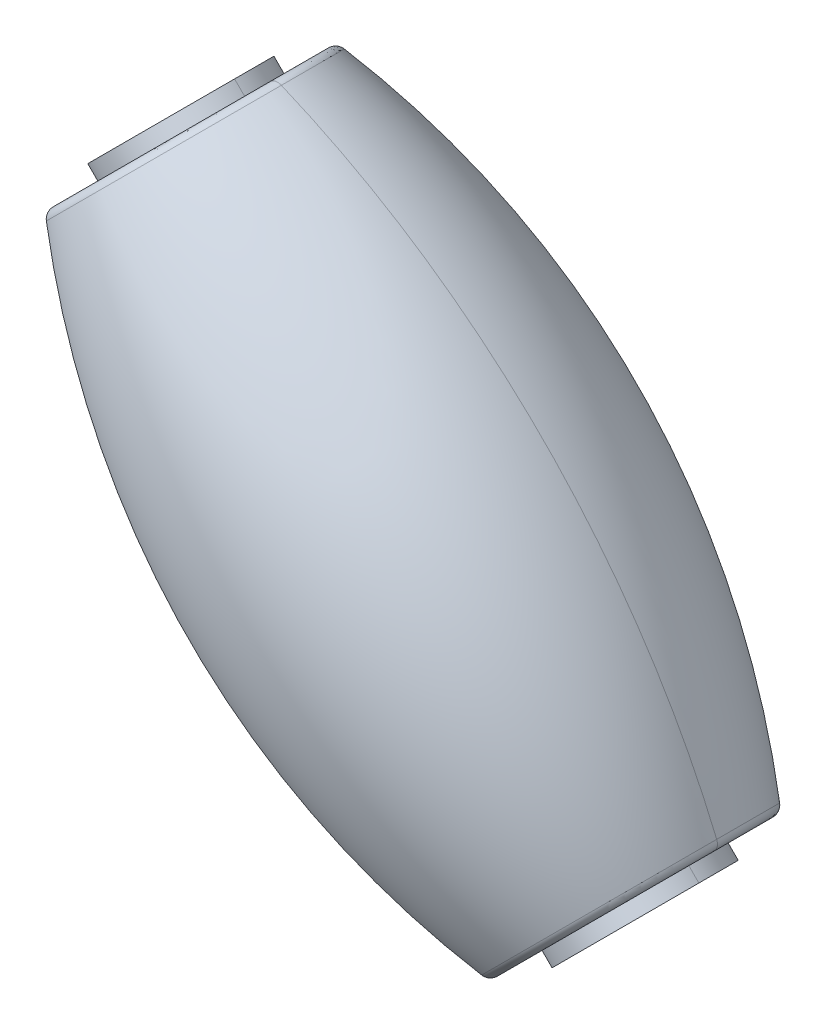
ISO-10303-21;
HEADER;
FILE_DESCRIPTION(('STEP AP214'),'2;1');
FILE_NAME('part.step','',(''),(''),'','','');
FILE_SCHEMA(('AUTOMOTIVE_DESIGN { 1 0 10303 214 1 1 1 1 }'));
ENDSEC;
DATA;
#1=APPLICATION_CONTEXT('core data for automotive mechanical design processes');
#2=APPLICATION_PROTOCOL_DEFINITION('international standard','automotive_design',2000,#1);
#3=PRODUCT_CONTEXT('',#1,'mechanical');
#4=PRODUCT('Part','Part','',(#3));
#5=PRODUCT_RELATED_PRODUCT_CATEGORY('part','',(#4));
#6=PRODUCT_DEFINITION_FORMATION('','',#4);
#7=PRODUCT_DEFINITION_CONTEXT('part definition',#1,'design');
#8=PRODUCT_DEFINITION('design','',#6,#7);
#9=PRODUCT_DEFINITION_SHAPE('','',#8);
#10=(LENGTH_UNIT() NAMED_UNIT(*) SI_UNIT(.MILLI.,.METRE.));
#11=(NAMED_UNIT(*) PLANE_ANGLE_UNIT() SI_UNIT($,.RADIAN.));
#12=(NAMED_UNIT(*) SI_UNIT($,.STERADIAN.) SOLID_ANGLE_UNIT());
#13=UNCERTAINTY_MEASURE_WITH_UNIT(LENGTH_MEASURE(1.E-05),#10,'distance_accuracy_value','');
#14=(GEOMETRIC_REPRESENTATION_CONTEXT(3) GLOBAL_UNCERTAINTY_ASSIGNED_CONTEXT((#13)) GLOBAL_UNIT_ASSIGNED_CONTEXT((#10,
#11,#12)) REPRESENTATION_CONTEXT('',''));
#15=CARTESIAN_POINT('',(0.,0.,0.));
#16=DIRECTION('',(0.,0.,1.));
#17=DIRECTION('',(1.,0.,0.));
#18=AXIS2_PLACEMENT_3D('',#15,#16,#17);
#19=CARTESIAN_POINT('',(52.5404268199212,3.13716113070749,0.));
#20=DIRECTION('',(-0.707106781186548,0.707106781186548,0.));
#21=DIRECTION('',(-0.707106781186548,-0.707106781186548,0.));
#22=AXIS2_PLACEMENT_3D('',#19,#20,#21);
#23=CYLINDRICAL_SURFACE('',#22,4.7625);
#24=CARTESIAN_POINT('',(13.9193969876572,41.7581909629715,0.));
#25=DIRECTION('',(0.707106781186548,-0.707106781186548,0.));
#26=DIRECTION('',(0.707106781186548,0.707106781186548,0.));
#27=AXIS2_PLACEMENT_3D('',#24,#25,#26);
#28=CIRCLE('',#27,4.7625);
#29=CARTESIAN_POINT('',(17.2869930330581,45.1257870083725,0.));
#30=VERTEX_POINT('',#29);
#31=CARTESIAN_POINT('',(10.5518009422562,38.3905949175706,0.));
#32=VERTEX_POINT('',#31);
#33=EDGE_CURVE('E20',#30,#32,#28,.T.);
#34=ORIENTED_EDGE('',*,*,#33,.F.);
#35=DIRECTION('',(-0.707106781186548,0.707106781186548,0.));
#36=VECTOR('',#35,1.);
#37=CARTESIAN_POINT('',(55.9080228653222,6.50475717610842,0.));
#38=LINE('',#37,#36);
#39=CARTESIAN_POINT('',(16.6583751045832,45.7544049368473,0.));
#40=VERTEX_POINT('',#39);
#41=EDGE_CURVE('E11',#30,#40,#38,.T.);
#42=ORIENTED_EDGE('',*,*,#41,.T.);
#43=CARTESIAN_POINT('',(13.2907790591823,42.3868088914464,0.));
#44=DIRECTION('',(-0.707106781186548,0.707106781186548,0.));
#45=DIRECTION('',(-0.707106781186548,-0.707106781186548,0.));
#46=AXIS2_PLACEMENT_3D('',#43,#44,#45);
#47=CIRCLE('',#46,4.7625);
#48=CARTESIAN_POINT('',(9.92318301378141,39.0192128460455,0.));
#49=VERTEX_POINT('',#48);
#50=EDGE_CURVE('E178',#49,#40,#47,.T.);
#51=ORIENTED_EDGE('',*,*,#50,.F.);
#52=DIRECTION('',(-0.707106781186548,0.707106781186548,0.));
#53=VECTOR('',#52,1.);
#54=CARTESIAN_POINT('',(49.1728307745203,-0.230434914693447,0.));
#55=LINE('',#54,#53);
#56=EDGE_CURVE('E199',#32,#49,#55,.T.);
#57=ORIENTED_EDGE('',*,*,#56,.F.);
#58=EDGE_LOOP('',(#34,#42,#51,#57));
#59=FACE_BOUND('',#58,.T.);
#60=ADVANCED_FACE('F16',(#59),#23,.T.);
#61=CARTESIAN_POINT('',(47.0339011738895,8.64368677673921,0.));
#62=DIRECTION('',(-0.707106781186547,0.707106781186548,0.));
#63=DIRECTION('',(-0.707106781186548,-0.707106781186547,0.));
#64=AXIS2_PLACEMENT_3D('',#61,#62,#63);
#65=CYLINDRICAL_SURFACE('',#64,1.5875);
#66=CARTESIAN_POINT('',(42.3868088914464,13.2907790591823,0.));
#67=DIRECTION('',(0.707106781186548,-0.707106781186548,0.));
#68=DIRECTION('',(-0.707106781186548,-0.707106781186548,0.));
#69=AXIS2_PLACEMENT_3D('',#66,#67,#68);
#70=CIRCLE('',#69,1.5875);
#71=CARTESIAN_POINT('',(41.2642768763127,12.1682470440487,0.));
#72=VERTEX_POINT('',#71);
#73=CARTESIAN_POINT('',(43.5093409065801,14.413311074316,0.));
#74=VERTEX_POINT('',#73);
#75=EDGE_CURVE('E27',#72,#74,#70,.T.);
#76=ORIENTED_EDGE('',*,*,#75,.T.);
#77=DIRECTION('',(-0.707106781186548,0.707106781186548,0.));
#78=VECTOR('',#77,1.);
#79=CARTESIAN_POINT('',(48.1564331890232,9.76621879187286,0.));
#80=LINE('',#79,#78);
#81=CARTESIAN_POINT('',(14.413311074316,43.5093409065801,0.));
#82=VERTEX_POINT('',#81);
#83=EDGE_CURVE('E90',#74,#82,#80,.T.);
#84=ORIENTED_EDGE('',*,*,#83,.T.);
#85=CARTESIAN_POINT('',(13.2907790591823,42.3868088914464,0.));
#86=DIRECTION('',(-0.707106781186548,0.707106781186548,0.));
#87=DIRECTION('',(-0.707106781186548,-0.707106781186548,0.));
#88=AXIS2_PLACEMENT_3D('',#85,#86,#87);
#89=CIRCLE('',#88,1.5875);
#90=CARTESIAN_POINT('',(12.1682470440487,41.2642768763127,0.));
#91=VERTEX_POINT('',#90);
#92=EDGE_CURVE('E80',#82,#91,#89,.T.);
#93=ORIENTED_EDGE('',*,*,#92,.T.);
#94=DIRECTION('',(-0.707106781186548,0.707106781186548,0.));
#95=VECTOR('',#94,1.);
#96=CARTESIAN_POINT('',(45.9113691587559,7.52115476160557,0.));
#97=LINE('',#96,#95);
#98=EDGE_CURVE('E209',#72,#91,#97,.T.);
#99=ORIENTED_EDGE('',*,*,#98,.F.);
#100=EDGE_LOOP('',(#76,#84,#93,#99));
#101=FACE_BOUND('',#100,.T.);
#102=ADVANCED_FACE('F267',(#101),#65,.F.);
#103=CARTESIAN_POINT('',(52.5404268199212,3.13716113070749,0.));
#104=DIRECTION('',(-0.707106781186548,0.707106781186548,0.));
#105=DIRECTION('',(-0.707106781186548,-0.707106781186548,0.));
#106=AXIS2_PLACEMENT_3D('',#103,#104,#105);
#107=CYLINDRICAL_SURFACE('',#106,4.7625);
#108=CARTESIAN_POINT('',(42.3868088914464,13.2907790591823,0.));
#109=DIRECTION('',(0.707106781186548,-0.707106781186548,0.));
#110=DIRECTION('',(-0.707106781186548,-0.707106781186548,0.));
#111=AXIS2_PLACEMENT_3D('',#108,#109,#110);
#112=CIRCLE('',#111,4.7625);
#113=CARTESIAN_POINT('',(45.7544049368473,16.6583751045832,0.));
#114=VERTEX_POINT('',#113);
#115=CARTESIAN_POINT('',(39.0192128460455,9.9231830137814,0.));
#116=VERTEX_POINT('',#115);
#117=EDGE_CURVE('E231',#114,#116,#112,.T.);
#118=ORIENTED_EDGE('',*,*,#117,.F.);
#119=DIRECTION('',(-0.707106781186548,0.707106781186548,0.));
#120=VECTOR('',#119,1.);
#121=CARTESIAN_POINT('',(55.9080228653222,6.50475717610842,0.));
#122=LINE('',#121,#120);
#123=CARTESIAN_POINT('',(45.1257870083725,17.2869930330581,0.));
#124=VERTEX_POINT('',#123);
#125=EDGE_CURVE('E149',#114,#124,#122,.T.);
#126=ORIENTED_EDGE('',*,*,#125,.T.);
#127=CARTESIAN_POINT('',(41.7581909629715,13.9193969876572,0.));
#128=DIRECTION('',(-0.707106781186548,0.707106781186548,0.));
#129=DIRECTION('',(-0.707106781186548,-0.707106781186548,0.));
#130=AXIS2_PLACEMENT_3D('',#127,#128,#129);
#131=CIRCLE('',#130,4.7625);
#132=CARTESIAN_POINT('',(38.3905949175707,10.5518009422562,0.));
#133=VERTEX_POINT('',#132);
#134=EDGE_CURVE('E240',#133,#124,#131,.T.);
#135=ORIENTED_EDGE('',*,*,#134,.F.);
#136=DIRECTION('',(-0.707106781186548,0.707106781186548,0.));
#137=VECTOR('',#136,1.);
#138=CARTESIAN_POINT('',(49.1728307745203,-0.230434914693447,0.));
#139=LINE('',#138,#137);
#140=EDGE_CURVE('E218',#116,#133,#139,.T.);
#141=ORIENTED_EDGE('',*,*,#140,.F.);
#142=EDGE_LOOP('',(#118,#126,#135,#141));
#143=FACE_BOUND('',#142,.T.);
#144=ADVANCED_FACE('F272',(#143),#107,.T.);
#145=CARTESIAN_POINT('',(14.3684097937106,41.3091781569181,0.));
#146=DIRECTION('',(0.707106781186548,-0.707106781186548,0.));
#147=DIRECTION('',(0.707106781186548,0.707106781186548,0.));
#148=AXIS2_PLACEMENT_3D('',#145,#146,#147);
#149=TOROIDAL_SURFACE('',#148,7.0371624321074,0.635);
#150=CARTESIAN_POINT('',(13.9193969876572,41.7581909629715,0.));
#151=DIRECTION('',(-0.707106781186547,0.707106781186548,0.));
#152=DIRECTION('',(0.707106781186548,0.707106781186547,0.));
#153=AXIS2_PLACEMENT_3D('',#150,#151,#152);
#154=CIRCLE('',#153,7.0371624321074);
#155=CARTESIAN_POINT('',(8.94337171160283,36.7821656869172,0.));
#156=VERTEX_POINT('',#155);
#157=CARTESIAN_POINT('',(18.8954222637115,46.7342162390259,0.));
#158=VERTEX_POINT('',#157);
#159=EDGE_CURVE('E130',#156,#158,#154,.T.);
#160=ORIENTED_EDGE('',*,*,#159,.F.);
#161=CARTESIAN_POINT('',(9.39238451765629,36.3331528808638,0.));
#162=DIRECTION('',(0.,0.,1.));
#163=DIRECTION('',(0.,-1.,0.));
#164=AXIS2_PLACEMENT_3D('',#161,#162,#163);
#165=CIRCLE('',#164,0.635);
#166=CARTESIAN_POINT('',(8.80649586660601,36.0882866141578,0.));
#167=VERTEX_POINT('',#166);
#168=EDGE_CURVE('E134',#156,#167,#165,.T.);
#169=ORIENTED_EDGE('',*,*,#168,.T.);
#170=CARTESIAN_POINT('',(14.1978986015384,41.4796893490903,0.));
#171=DIRECTION('',(0.707106781186548,-0.707106781186547,0.));
#172=DIRECTION('',(0.707106781186547,0.707106781186548,0.));
#173=AXIS2_PLACEMENT_3D('',#170,#171,#172);
#174=CIRCLE('',#173,7.62459486795686);
#175=CARTESIAN_POINT('',(19.5893013364709,46.8710920840228,0.));
#176=VERTEX_POINT('',#175);
#177=EDGE_CURVE('E213',#176,#167,#174,.T.);
#178=ORIENTED_EDGE('',*,*,#177,.F.);
#179=CARTESIAN_POINT('',(19.344435069765,46.2852034329725,0.));
#180=DIRECTION('',(0.,0.,-1.));
#181=DIRECTION('',(-1.,0.,0.));
#182=AXIS2_PLACEMENT_3D('',#179,#180,#181);
#183=CIRCLE('',#182,0.635);
#184=EDGE_CURVE('E136',#158,#176,#183,.T.);
#185=ORIENTED_EDGE('',*,*,#184,.F.);
#186=EDGE_LOOP('',(#160,#169,#178,#185));
#187=FACE_BOUND('',#186,.T.);
#188=ADVANCED_FACE('F132',(#187),#149,.T.);
#189=CARTESIAN_POINT('',(41.3091781569181,14.3684097937106,0.));
#190=DIRECTION('',(-0.707106781186548,0.707106781186548,0.));
#191=DIRECTION('',(-0.707106781186548,-0.707106781186548,0.));
#192=AXIS2_PLACEMENT_3D('',#189,#190,#191);
#193=TOROIDAL_SURFACE('',#192,7.03716243210739,0.635);
#194=CARTESIAN_POINT('',(41.7581909629715,13.9193969876572,0.));
#195=DIRECTION('',(0.707106781186548,-0.707106781186548,0.));
#196=DIRECTION('',(-0.707106781186548,-0.707106781186548,0.));
#197=AXIS2_PLACEMENT_3D('',#194,#195,#196);
#198=CIRCLE('',#197,7.03716243210739);
#199=CARTESIAN_POINT('',(46.7342162390259,18.8954222637115,0.));
#200=VERTEX_POINT('',#199);
#201=CARTESIAN_POINT('',(36.7821656869172,8.94337171160283,0.));
#202=VERTEX_POINT('',#201);
#203=EDGE_CURVE('E164',#200,#202,#198,.T.);
#204=ORIENTED_EDGE('',*,*,#203,.F.);
#205=CARTESIAN_POINT('',(46.2852034329725,19.344435069765,0.));
#206=DIRECTION('',(0.,0.,1.));
#207=DIRECTION('',(0.,-1.,0.));
#208=AXIS2_PLACEMENT_3D('',#205,#206,#207);
#209=CIRCLE('',#208,0.635);
#210=CARTESIAN_POINT('',(46.8710920840228,19.5893013364709,0.));
#211=VERTEX_POINT('',#210);
#212=EDGE_CURVE('E150',#200,#211,#209,.T.);
#213=ORIENTED_EDGE('',*,*,#212,.T.);
#214=CARTESIAN_POINT('',(41.4796893490903,14.1978986015384,0.));
#215=DIRECTION('',(-0.707106781186548,0.707106781186548,0.));
#216=DIRECTION('',(-0.707106781186548,-0.707106781186548,0.));
#217=AXIS2_PLACEMENT_3D('',#214,#215,#216);
#218=CIRCLE('',#217,7.62459486795685);
#219=CARTESIAN_POINT('',(36.0882866141579,8.80649586660601,0.));
#220=VERTEX_POINT('',#219);
#221=EDGE_CURVE('E173',#220,#211,#218,.T.);
#222=ORIENTED_EDGE('',*,*,#221,.F.);
#223=CARTESIAN_POINT('',(36.3331528808638,9.39238451765629,0.));
#224=DIRECTION('',(0.,0.,-1.));
#225=DIRECTION('',(-1.,0.,0.));
#226=AXIS2_PLACEMENT_3D('',#223,#224,#225);
#227=CIRCLE('',#226,0.635);
#228=EDGE_CURVE('E166',#202,#220,#227,.T.);
#229=ORIENTED_EDGE('',*,*,#228,.F.);
#230=EDGE_LOOP('',(#204,#213,#222,#229));
#231=FACE_BOUND('',#230,.T.);
#232=ADVANCED_FACE('F294',(#231),#193,.T.);
#233=CARTESIAN_POINT('',(27.8387939753143,27.8387939753144,0.));
#234=DIRECTION('',(-0.707106781186548,0.707106781186548,0.));
#235=DIRECTION('',(0.707106781186548,0.707106781186548,0.));
#236=AXIS2_PLACEMENT_3D('',#233,#234,#235);
#237=DEGENERATE_TOROIDAL_SURFACE('',#236,39.37,50.8,.F.);
#238=ORIENTED_EDGE('',*,*,#221,.T.);
#239=CARTESIAN_POINT('',(0.,0.,0.));
#240=DIRECTION('',(0.,0.,1.));
#241=DIRECTION('',(0.,-1.,0.));
#242=AXIS2_PLACEMENT_3D('',#239,#240,#241);
#243=CIRCLE('',#242,50.8);
#244=EDGE_CURVE('E182',#211,#176,#243,.T.);
#245=ORIENTED_EDGE('',*,*,#244,.T.);
#246=ORIENTED_EDGE('',*,*,#177,.T.);
#247=CARTESIAN_POINT('',(55.6775879506287,55.6775879506287,0.));
#248=DIRECTION('',(0.,0.,-1.));
#249=DIRECTION('',(-1.,0.,0.));
#250=AXIS2_PLACEMENT_3D('',#247,#248,#249);
#251=CIRCLE('',#250,50.8);
#252=EDGE_CURVE('E160',#220,#167,#251,.T.);
#253=ORIENTED_EDGE('',*,*,#252,.F.);
#254=EDGE_LOOP('',(#238,#245,#246,#253));
#255=FACE_BOUND('',#254,.T.);
#256=ADVANCED_FACE('F297',(#255),#237,.F.);
#257=CARTESIAN_POINT('',(27.8387939753143,27.8387939753144,0.));
#258=DIRECTION('',(-0.707106781186548,0.707106781186548,0.));
#259=DIRECTION('',(0.707106781186548,0.707106781186548,0.));
#260=AXIS2_PLACEMENT_3D('',#257,#258,#259);
#261=DEGENERATE_TOROIDAL_SURFACE('',#260,39.37,50.8,.F.);
#262=ORIENTED_EDGE('',*,*,#244,.F.);
#263=CARTESIAN_POINT('',(41.4796893490903,14.1978986015384,0.));
#264=DIRECTION('',(-0.707106781186548,0.707106781186548,0.));
#265=DIRECTION('',(-0.707106781186548,-0.707106781186548,0.));
#266=AXIS2_PLACEMENT_3D('',#263,#264,#265);
#267=CIRCLE('',#266,7.62459486795685);
#268=EDGE_CURVE('E217',#211,#220,#267,.T.);
#269=ORIENTED_EDGE('',*,*,#268,.T.);
#270=ORIENTED_EDGE('',*,*,#252,.T.);
#271=CARTESIAN_POINT('',(14.1978986015384,41.4796893490903,0.));
#272=DIRECTION('',(0.707106781186548,-0.707106781186547,0.));
#273=DIRECTION('',(0.707106781186547,0.707106781186548,0.));
#274=AXIS2_PLACEMENT_3D('',#271,#272,#273);
#275=CIRCLE('',#274,7.62459486795686);
#276=EDGE_CURVE('E147',#167,#176,#275,.T.);
#277=ORIENTED_EDGE('',*,*,#276,.T.);
#278=EDGE_LOOP('',(#262,#269,#270,#277));
#279=FACE_BOUND('',#278,.T.);
#280=ADVANCED_FACE('F300',(#279),#261,.F.);
#281=CARTESIAN_POINT('',(19.1951071985752,47.0339011738895,0.));
#282=DIRECTION('',(0.707106781186548,-0.707106781186548,0.));
#283=DIRECTION('',(0.,0.,-1.));
#284=AXIS2_PLACEMENT_3D('',#281,#282,#283);
#285=PLANE('',#284);
#286=CARTESIAN_POINT('',(13.9193969876572,41.7581909629715,0.));
#287=DIRECTION('',(-0.707106781186547,0.707106781186548,0.));
#288=DIRECTION('',(0.707106781186548,0.707106781186547,0.));
#289=AXIS2_PLACEMENT_3D('',#286,#287,#288);
#290=CIRCLE('',#289,7.0371624321074);
#291=EDGE_CURVE('E141',#158,#156,#290,.T.);
#292=ORIENTED_EDGE('',*,*,#291,.T.);
#293=ORIENTED_EDGE('',*,*,#159,.T.);
#294=EDGE_LOOP('',(#292,#293));
#295=FACE_BOUND('',#294,.T.);
#296=CARTESIAN_POINT('',(13.9193969876572,41.7581909629715,0.));
#297=DIRECTION('',(0.707106781186548,-0.707106781186548,0.));
#298=DIRECTION('',(0.707106781186548,0.707106781186548,0.));
#299=AXIS2_PLACEMENT_3D('',#296,#297,#298);
#300=CIRCLE('',#299,4.7625);
#301=EDGE_CURVE('E142',#32,#30,#300,.T.);
#302=ORIENTED_EDGE('',*,*,#301,.T.);
#303=ORIENTED_EDGE('',*,*,#33,.T.);
#304=EDGE_LOOP('',(#302,#303));
#305=FACE_BOUND('',#304,.T.);
#306=ADVANCED_FACE('F152',(#295,#305),#285,.F.);
#307=CARTESIAN_POINT('',(41.7581909629715,13.9193969876572,0.));
#308=DIRECTION('',(-0.707106781186548,0.707106781186548,0.));
#309=DIRECTION('',(0.,0.,1.));
#310=AXIS2_PLACEMENT_3D('',#307,#308,#309);
#311=PLANE('',#310);
#312=CARTESIAN_POINT('',(41.7581909629715,13.9193969876572,0.));
#313=DIRECTION('',(0.707106781186548,-0.707106781186548,0.));
#314=DIRECTION('',(-0.707106781186548,-0.707106781186548,0.));
#315=AXIS2_PLACEMENT_3D('',#312,#313,#314);
#316=CIRCLE('',#315,7.03716243210739);
#317=EDGE_CURVE('E183',#202,#200,#316,.T.);
#318=ORIENTED_EDGE('',*,*,#317,.T.);
#319=ORIENTED_EDGE('',*,*,#203,.T.);
#320=EDGE_LOOP('',(#318,#319));
#321=FACE_BOUND('',#320,.T.);
#322=ORIENTED_EDGE('',*,*,#134,.T.);
#323=CARTESIAN_POINT('',(41.7581909629715,13.9193969876572,0.));
#324=DIRECTION('',(-0.707106781186548,0.707106781186548,0.));
#325=DIRECTION('',(-0.707106781186548,-0.707106781186548,0.));
#326=AXIS2_PLACEMENT_3D('',#323,#324,#325);
#327=CIRCLE('',#326,4.7625);
#328=EDGE_CURVE('E169',#124,#133,#327,.T.);
#329=ORIENTED_EDGE('',*,*,#328,.T.);
#330=EDGE_LOOP('',(#322,#329));
#331=FACE_BOUND('',#330,.T.);
#332=ADVANCED_FACE('F280',(#321,#331),#311,.F.);
#333=CARTESIAN_POINT('',(41.3091781569181,14.3684097937106,0.));
#334=DIRECTION('',(-0.707106781186548,0.707106781186548,0.));
#335=DIRECTION('',(-0.707106781186548,-0.707106781186548,0.));
#336=AXIS2_PLACEMENT_3D('',#333,#334,#335);
#337=TOROIDAL_SURFACE('',#336,7.03716243210739,0.635);
#338=ORIENTED_EDGE('',*,*,#212,.F.);
#339=ORIENTED_EDGE('',*,*,#317,.F.);
#340=ORIENTED_EDGE('',*,*,#228,.T.);
#341=ORIENTED_EDGE('',*,*,#268,.F.);
#342=EDGE_LOOP('',(#338,#339,#340,#341));
#343=FACE_BOUND('',#342,.T.);
#344=ADVANCED_FACE('F279',(#343),#337,.T.);
#345=CARTESIAN_POINT('',(14.3684097937106,41.3091781569181,0.));
#346=DIRECTION('',(0.707106781186548,-0.707106781186548,0.));
#347=DIRECTION('',(0.707106781186548,0.707106781186548,0.));
#348=AXIS2_PLACEMENT_3D('',#345,#346,#347);
#349=TOROIDAL_SURFACE('',#348,7.0371624321074,0.635);
#350=ORIENTED_EDGE('',*,*,#168,.F.);
#351=ORIENTED_EDGE('',*,*,#291,.F.);
#352=ORIENTED_EDGE('',*,*,#184,.T.);
#353=ORIENTED_EDGE('',*,*,#276,.F.);
#354=EDGE_LOOP('',(#350,#351,#352,#353));
#355=FACE_BOUND('',#354,.T.);
#356=ADVANCED_FACE('F145',(#355),#349,.T.);
#357=CARTESIAN_POINT('',(52.5404268199212,3.13716113070749,0.));
#358=DIRECTION('',(-0.707106781186548,0.707106781186548,0.));
#359=DIRECTION('',(-0.707106781186548,-0.707106781186548,0.));
#360=AXIS2_PLACEMENT_3D('',#357,#358,#359);
#361=CYLINDRICAL_SURFACE('',#360,4.7625);
#362=ORIENTED_EDGE('',*,*,#125,.F.);
#363=CARTESIAN_POINT('',(42.3868088914464,13.2907790591823,0.));
#364=DIRECTION('',(0.707106781186548,-0.707106781186548,0.));
#365=DIRECTION('',(-0.707106781186548,-0.707106781186548,0.));
#366=AXIS2_PLACEMENT_3D('',#363,#364,#365);
#367=CIRCLE('',#366,4.7625);
#368=EDGE_CURVE('E221',#116,#114,#367,.T.);
#369=ORIENTED_EDGE('',*,*,#368,.F.);
#370=ORIENTED_EDGE('',*,*,#140,.T.);
#371=ORIENTED_EDGE('',*,*,#328,.F.);
#372=EDGE_LOOP('',(#362,#369,#370,#371));
#373=FACE_BOUND('',#372,.T.);
#374=ADVANCED_FACE('F278',(#373),#361,.T.);
#375=CARTESIAN_POINT('',(42.3868088914464,13.2907790591823,0.));
#376=DIRECTION('',(-0.707106781186548,0.707106781186548,0.));
#377=DIRECTION('',(0.,0.,1.));
#378=AXIS2_PLACEMENT_3D('',#375,#376,#377);
#379=PLANE('',#378);
#380=ORIENTED_EDGE('',*,*,#368,.T.);
#381=ORIENTED_EDGE('',*,*,#117,.T.);
#382=EDGE_LOOP('',(#380,#381));
#383=FACE_BOUND('',#382,.T.);
#384=ORIENTED_EDGE('',*,*,#75,.F.);
#385=CARTESIAN_POINT('',(42.3868088914464,13.2907790591823,0.));
#386=DIRECTION('',(0.707106781186548,-0.707106781186548,0.));
#387=DIRECTION('',(-0.707106781186548,-0.707106781186548,0.));
#388=AXIS2_PLACEMENT_3D('',#385,#386,#387);
#389=CIRCLE('',#388,1.5875);
#390=EDGE_CURVE('E211',#74,#72,#389,.T.);
#391=ORIENTED_EDGE('',*,*,#390,.F.);
#392=EDGE_LOOP('',(#384,#391));
#393=FACE_BOUND('',#392,.T.);
#394=ADVANCED_FACE('F286',(#383,#393),#379,.F.);
#395=CARTESIAN_POINT('',(47.0339011738895,8.64368677673921,0.));
#396=DIRECTION('',(-0.707106781186547,0.707106781186548,0.));
#397=DIRECTION('',(-0.707106781186548,-0.707106781186547,0.));
#398=AXIS2_PLACEMENT_3D('',#395,#396,#397);
#399=CYLINDRICAL_SURFACE('',#398,1.5875);
#400=ORIENTED_EDGE('',*,*,#83,.F.);
#401=ORIENTED_EDGE('',*,*,#390,.T.);
#402=ORIENTED_EDGE('',*,*,#98,.T.);
#403=CARTESIAN_POINT('',(13.2907790591823,42.3868088914464,0.));
#404=DIRECTION('',(-0.707106781186548,0.707106781186548,0.));
#405=DIRECTION('',(-0.707106781186548,-0.707106781186548,0.));
#406=AXIS2_PLACEMENT_3D('',#403,#404,#405);
#407=CIRCLE('',#406,1.5875);
#408=EDGE_CURVE('E206',#91,#82,#407,.T.);
#409=ORIENTED_EDGE('',*,*,#408,.T.);
#410=EDGE_LOOP('',(#400,#401,#402,#409));
#411=FACE_BOUND('',#410,.T.);
#412=ADVANCED_FACE('F255',(#411),#399,.F.);
#413=CARTESIAN_POINT('',(52.5404268199212,3.13716113070749,0.));
#414=DIRECTION('',(-0.707106781186548,0.707106781186548,0.));
#415=DIRECTION('',(-0.707106781186548,-0.707106781186548,0.));
#416=AXIS2_PLACEMENT_3D('',#413,#414,#415);
#417=CYLINDRICAL_SURFACE('',#416,4.7625);
#418=ORIENTED_EDGE('',*,*,#41,.F.);
#419=ORIENTED_EDGE('',*,*,#301,.F.);
#420=ORIENTED_EDGE('',*,*,#56,.T.);
#421=CARTESIAN_POINT('',(13.2907790591823,42.3868088914464,0.));
#422=DIRECTION('',(-0.707106781186548,0.707106781186548,0.));
#423=DIRECTION('',(-0.707106781186548,-0.707106781186548,0.));
#424=AXIS2_PLACEMENT_3D('',#421,#422,#423);
#425=CIRCLE('',#424,4.7625);
#426=EDGE_CURVE('E174',#40,#49,#425,.T.);
#427=ORIENTED_EDGE('',*,*,#426,.F.);
#428=EDGE_LOOP('',(#418,#419,#420,#427));
#429=FACE_BOUND('',#428,.T.);
#430=ADVANCED_FACE('F18',(#429),#417,.T.);
#431=CARTESIAN_POINT('',(13.2907790591823,42.3868088914464,0.));
#432=DIRECTION('',(-0.707106781186548,0.707106781186548,0.));
#433=DIRECTION('',(0.,0.,1.));
#434=AXIS2_PLACEMENT_3D('',#431,#432,#433);
#435=PLANE('',#434);
#436=ORIENTED_EDGE('',*,*,#50,.T.);
#437=ORIENTED_EDGE('',*,*,#426,.T.);
#438=EDGE_LOOP('',(#436,#437));
#439=FACE_BOUND('',#438,.T.);
#440=ORIENTED_EDGE('',*,*,#408,.F.);
#441=ORIENTED_EDGE('',*,*,#92,.F.);
#442=EDGE_LOOP('',(#440,#441));
#443=FACE_BOUND('',#442,.T.);
#444=ADVANCED_FACE('F256',(#439,#443),#435,.T.);
#445=CLOSED_SHELL('',(#60,#102,#144,#188,#232,#256,#280,#306,#332,#344,#356,#374,#394,#412,#430,#444));
#446=MANIFOLD_SOLID_BREP('B1',#445);
#447=ADVANCED_BREP_SHAPE_REPRESENTATION('',(#18,#446),#14);
#448=SHAPE_DEFINITION_REPRESENTATION(#9,#447);
ENDSEC;
END-ISO-10303-21;
